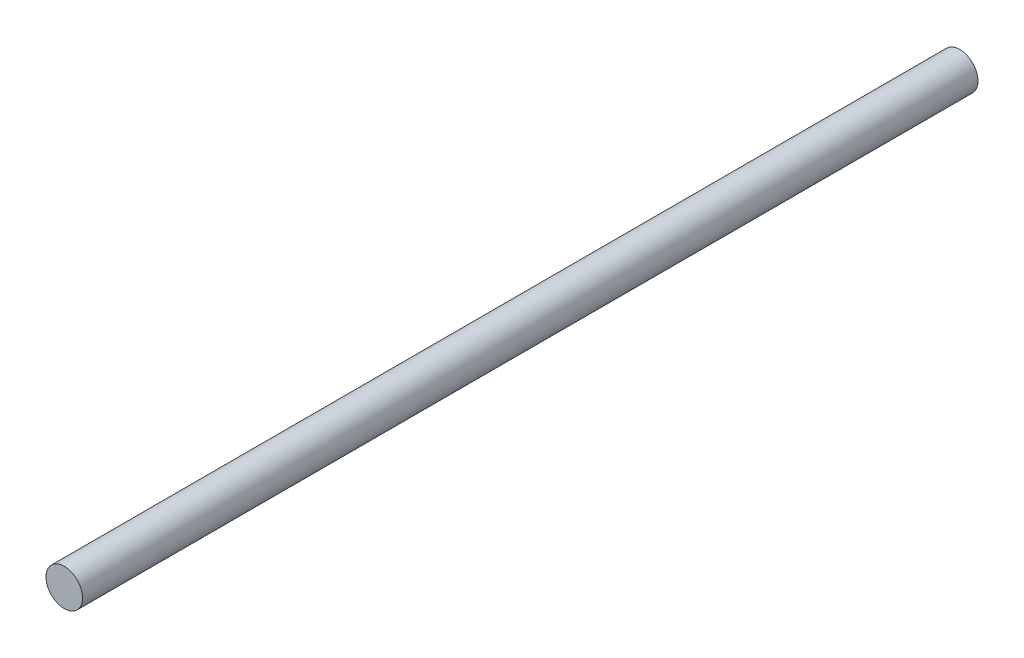
ISO-10303-21;
HEADER;
FILE_DESCRIPTION(('STEP AP214'),'2;1');
FILE_NAME('part.step','',(''),(''),'','','');
FILE_SCHEMA(('AUTOMOTIVE_DESIGN { 1 0 10303 214 1 1 1 1 }'));
ENDSEC;
DATA;
#1=APPLICATION_CONTEXT('core data for automotive mechanical design processes');
#2=APPLICATION_PROTOCOL_DEFINITION('international standard','automotive_design',2000,#1);
#3=PRODUCT_CONTEXT('',#1,'mechanical');
#4=PRODUCT('Part','Part','',(#3));
#5=PRODUCT_RELATED_PRODUCT_CATEGORY('part','',(#4));
#6=PRODUCT_DEFINITION_FORMATION('','',#4);
#7=PRODUCT_DEFINITION_CONTEXT('part definition',#1,'design');
#8=PRODUCT_DEFINITION('design','',#6,#7);
#9=PRODUCT_DEFINITION_SHAPE('','',#8);
#10=(LENGTH_UNIT() NAMED_UNIT(*) SI_UNIT(.MILLI.,.METRE.));
#11=(NAMED_UNIT(*) PLANE_ANGLE_UNIT() SI_UNIT($,.RADIAN.));
#12=(NAMED_UNIT(*) SI_UNIT($,.STERADIAN.) SOLID_ANGLE_UNIT());
#13=UNCERTAINTY_MEASURE_WITH_UNIT(LENGTH_MEASURE(1.E-05),#10,'distance_accuracy_value','');
#14=(GEOMETRIC_REPRESENTATION_CONTEXT(3) GLOBAL_UNCERTAINTY_ASSIGNED_CONTEXT((#13)) GLOBAL_UNIT_ASSIGNED_CONTEXT((#10,
#11,#12)) REPRESENTATION_CONTEXT('',''));
#15=CARTESIAN_POINT('',(0.,0.,0.));
#16=DIRECTION('',(0.,0.,1.));
#17=DIRECTION('',(1.,0.,0.));
#18=AXIS2_PLACEMENT_3D('',#15,#16,#17);
#19=CARTESIAN_POINT('',(0.,0.,330.));
#20=DIRECTION('',(0.,0.,-1.));
#21=DIRECTION('',(-1.,0.,0.));
#22=AXIS2_PLACEMENT_3D('',#19,#20,#21);
#23=CYLINDRICAL_SURFACE('',#22,6.75);
#24=CARTESIAN_POINT('',(0.,0.,330.));
#25=DIRECTION('',(0.,0.,1.));
#26=DIRECTION('',(1.,0.,0.));
#27=AXIS2_PLACEMENT_3D('',#24,#25,#26);
#28=CIRCLE('',#27,6.75);
#29=CARTESIAN_POINT('',(6.75,0.,330.));
#30=VERTEX_POINT('',#29);
#31=EDGE_CURVE('E10',#30,#30,#28,.T.);
#32=ORIENTED_EDGE('',*,*,#31,.F.);
#33=EDGE_LOOP('',(#32));
#34=FACE_BOUND('',#33,.T.);
#35=CARTESIAN_POINT('',(0.,0.,0.));
#36=DIRECTION('',(0.,0.,1.));
#37=DIRECTION('',(1.,0.,0.));
#38=AXIS2_PLACEMENT_3D('',#35,#36,#37);
#39=CIRCLE('',#38,6.75);
#40=CARTESIAN_POINT('',(6.75,0.,0.));
#41=VERTEX_POINT('',#40);
#42=EDGE_CURVE('E42',#41,#41,#39,.T.);
#43=ORIENTED_EDGE('',*,*,#42,.T.);
#44=EDGE_LOOP('',(#43));
#45=FACE_BOUND('',#44,.T.);
#46=ADVANCED_FACE('F39',(#34,#45),#23,.T.);
#47=CARTESIAN_POINT('',(0.,0.,330.));
#48=DIRECTION('',(0.,0.,1.));
#49=DIRECTION('',(1.,0.,0.));
#50=AXIS2_PLACEMENT_3D('',#47,#48,#49);
#51=PLANE('',#50);
#52=ORIENTED_EDGE('',*,*,#31,.T.);
#53=EDGE_LOOP('',(#52));
#54=FACE_BOUND('',#53,.T.);
#55=ADVANCED_FACE('F56',(#54),#51,.T.);
#56=CARTESIAN_POINT('',(0.,0.,0.));
#57=DIRECTION('',(0.,0.,1.));
#58=DIRECTION('',(1.,0.,0.));
#59=AXIS2_PLACEMENT_3D('',#56,#57,#58);
#60=PLANE('',#59);
#61=ORIENTED_EDGE('',*,*,#42,.F.);
#62=EDGE_LOOP('',(#61));
#63=FACE_BOUND('',#62,.T.);
#64=ADVANCED_FACE('F54',(#63),#60,.F.);
#65=CLOSED_SHELL('',(#46,#55,#64));
#66=MANIFOLD_SOLID_BREP('B2',#65);
#67=ADVANCED_BREP_SHAPE_REPRESENTATION('',(#18,#66),#14);
#68=SHAPE_DEFINITION_REPRESENTATION(#9,#67);
ENDSEC;
END-ISO-10303-21;
